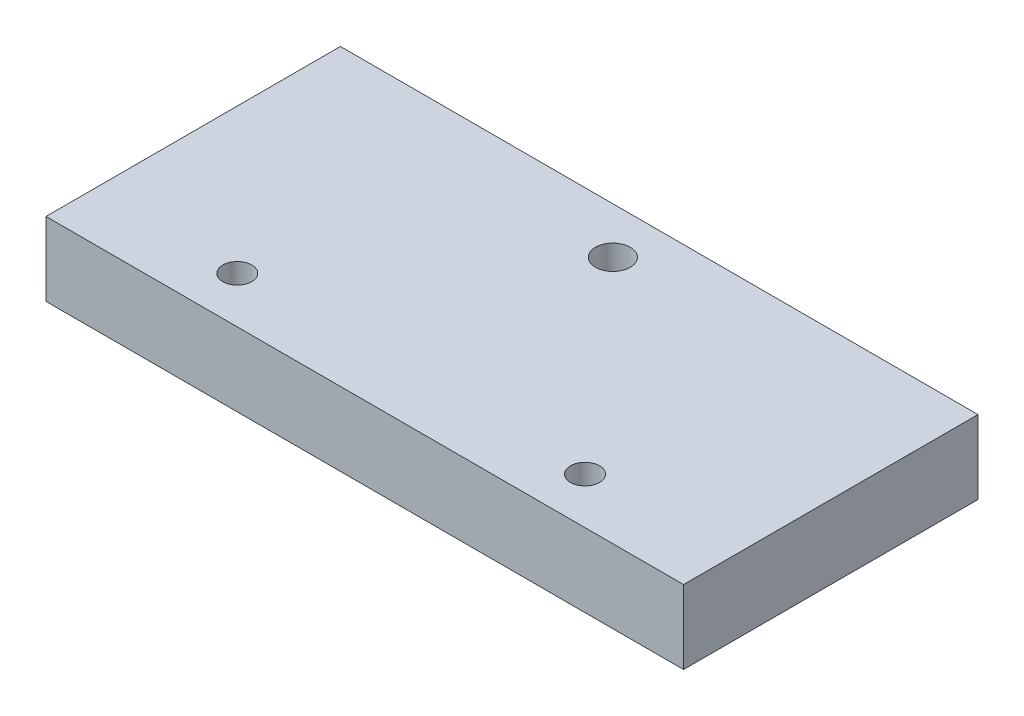
ISO-10303-21;
HEADER;
FILE_DESCRIPTION(('STEP AP214'),'2;1');
FILE_NAME('part.step','',(''),(''),'','','');
FILE_SCHEMA(('AUTOMOTIVE_DESIGN { 1 0 10303 214 1 1 1 1 }'));
ENDSEC;
DATA;
#1=APPLICATION_CONTEXT('core data for automotive mechanical design processes');
#2=APPLICATION_PROTOCOL_DEFINITION('international standard','automotive_design',2000,#1);
#3=PRODUCT_CONTEXT('',#1,'mechanical');
#4=PRODUCT('Part','Part','',(#3));
#5=PRODUCT_RELATED_PRODUCT_CATEGORY('part','',(#4));
#6=PRODUCT_DEFINITION_FORMATION('','',#4);
#7=PRODUCT_DEFINITION_CONTEXT('part definition',#1,'design');
#8=PRODUCT_DEFINITION('design','',#6,#7);
#9=PRODUCT_DEFINITION_SHAPE('','',#8);
#10=(LENGTH_UNIT() NAMED_UNIT(*) SI_UNIT(.MILLI.,.METRE.));
#11=(NAMED_UNIT(*) PLANE_ANGLE_UNIT() SI_UNIT($,.RADIAN.));
#12=(NAMED_UNIT(*) SI_UNIT($,.STERADIAN.) SOLID_ANGLE_UNIT());
#13=UNCERTAINTY_MEASURE_WITH_UNIT(LENGTH_MEASURE(1.E-05),#10,'distance_accuracy_value','');
#14=(GEOMETRIC_REPRESENTATION_CONTEXT(3) GLOBAL_UNCERTAINTY_ASSIGNED_CONTEXT((#13)) GLOBAL_UNIT_ASSIGNED_CONTEXT((#10,
#11,#12)) REPRESENTATION_CONTEXT('',''));
#15=CARTESIAN_POINT('',(0.,0.,0.));
#16=DIRECTION('',(0.,0.,1.));
#17=DIRECTION('',(1.,0.,0.));
#18=AXIS2_PLACEMENT_3D('',#15,#16,#17);
#19=CARTESIAN_POINT('',(-55.,12.7,25.4));
#20=DIRECTION('',(1.,0.,0.));
#21=DIRECTION('',(0.,0.,-1.));
#22=AXIS2_PLACEMENT_3D('',#19,#20,#21);
#23=PLANE('',#22);
#24=DIRECTION('',(0.,0.,1.));
#25=VECTOR('',#24,1.);
#26=CARTESIAN_POINT('',(-55.,0.,25.4));
#27=LINE('',#26,#25);
#28=CARTESIAN_POINT('',(-55.,0.,-25.4));
#29=VERTEX_POINT('',#28);
#30=CARTESIAN_POINT('',(-55.,0.,25.4));
#31=VERTEX_POINT('',#30);
#32=EDGE_CURVE('E96',#29,#31,#27,.T.);
#33=ORIENTED_EDGE('',*,*,#32,.T.);
#34=DIRECTION('',(0.,-1.,0.));
#35=VECTOR('',#34,1.);
#36=CARTESIAN_POINT('',(-55.,12.7,25.4));
#37=LINE('',#36,#35);
#38=CARTESIAN_POINT('',(-55.,12.7,25.4));
#39=VERTEX_POINT('',#38);
#40=EDGE_CURVE('E11',#39,#31,#37,.T.);
#41=ORIENTED_EDGE('',*,*,#40,.F.);
#42=DIRECTION('',(0.,0.,1.));
#43=VECTOR('',#42,1.);
#44=CARTESIAN_POINT('',(-55.,12.7,25.4));
#45=LINE('',#44,#43);
#46=CARTESIAN_POINT('',(-55.,12.7,-25.4));
#47=VERTEX_POINT('',#46);
#48=EDGE_CURVE('E84',#47,#39,#45,.T.);
#49=ORIENTED_EDGE('',*,*,#48,.F.);
#50=DIRECTION('',(0.,-1.,0.));
#51=VECTOR('',#50,1.);
#52=CARTESIAN_POINT('',(-55.,12.7,-25.4));
#53=LINE('',#52,#51);
#54=EDGE_CURVE('E92',#47,#29,#53,.T.);
#55=ORIENTED_EDGE('',*,*,#54,.T.);
#56=EDGE_LOOP('',(#33,#41,#49,#55));
#57=FACE_BOUND('',#56,.T.);
#58=ADVANCED_FACE('F33',(#57),#23,.F.);
#59=CARTESIAN_POINT('',(55.,12.7,25.4));
#60=DIRECTION('',(0.,0.,-1.));
#61=DIRECTION('',(-1.,0.,0.));
#62=AXIS2_PLACEMENT_3D('',#59,#60,#61);
#63=PLANE('',#62);
#64=DIRECTION('',(1.,0.,0.));
#65=VECTOR('',#64,1.);
#66=CARTESIAN_POINT('',(55.,0.,25.4));
#67=LINE('',#66,#65);
#68=CARTESIAN_POINT('',(55.,0.,25.4));
#69=VERTEX_POINT('',#68);
#70=EDGE_CURVE('E88',#31,#69,#67,.T.);
#71=ORIENTED_EDGE('',*,*,#70,.T.);
#72=DIRECTION('',(0.,-1.,0.));
#73=VECTOR('',#72,1.);
#74=CARTESIAN_POINT('',(55.,12.7,25.4));
#75=LINE('',#74,#73);
#76=CARTESIAN_POINT('',(55.,12.7,25.4));
#77=VERTEX_POINT('',#76);
#78=EDGE_CURVE('E41',#77,#69,#75,.T.);
#79=ORIENTED_EDGE('',*,*,#78,.F.);
#80=DIRECTION('',(1.,0.,0.));
#81=VECTOR('',#80,1.);
#82=CARTESIAN_POINT('',(55.,12.7,25.4));
#83=LINE('',#82,#81);
#84=EDGE_CURVE('E79',#39,#77,#83,.T.);
#85=ORIENTED_EDGE('',*,*,#84,.F.);
#86=ORIENTED_EDGE('',*,*,#40,.T.);
#87=EDGE_LOOP('',(#71,#79,#85,#86));
#88=FACE_BOUND('',#87,.T.);
#89=ADVANCED_FACE('F87',(#88),#63,.F.);
#90=CARTESIAN_POINT('',(55.,12.7,25.4));
#91=DIRECTION('',(-1.,0.,0.));
#92=DIRECTION('',(0.,0.,1.));
#93=AXIS2_PLACEMENT_3D('',#90,#91,#92);
#94=PLANE('',#93);
#95=DIRECTION('',(0.,0.,-1.));
#96=VECTOR('',#95,1.);
#97=CARTESIAN_POINT('',(55.,0.,25.4));
#98=LINE('',#97,#96);
#99=CARTESIAN_POINT('',(55.,0.,-25.4));
#100=VERTEX_POINT('',#99);
#101=EDGE_CURVE('E66',#69,#100,#98,.T.);
#102=ORIENTED_EDGE('',*,*,#101,.T.);
#103=DIRECTION('',(0.,-1.,0.));
#104=VECTOR('',#103,1.);
#105=CARTESIAN_POINT('',(55.,12.7,-25.4));
#106=LINE('',#105,#104);
#107=CARTESIAN_POINT('',(55.,12.7,-25.4));
#108=VERTEX_POINT('',#107);
#109=EDGE_CURVE('E89',#108,#100,#106,.T.);
#110=ORIENTED_EDGE('',*,*,#109,.F.);
#111=DIRECTION('',(0.,0.,-1.));
#112=VECTOR('',#111,1.);
#113=CARTESIAN_POINT('',(55.,12.7,25.4));
#114=LINE('',#113,#112);
#115=EDGE_CURVE('E82',#77,#108,#114,.T.);
#116=ORIENTED_EDGE('',*,*,#115,.F.);
#117=ORIENTED_EDGE('',*,*,#78,.T.);
#118=EDGE_LOOP('',(#102,#110,#116,#117));
#119=FACE_BOUND('',#118,.T.);
#120=ADVANCED_FACE('F90',(#119),#94,.F.);
#121=CARTESIAN_POINT('',(55.,12.7,-25.4));
#122=DIRECTION('',(0.,0.,1.));
#123=DIRECTION('',(1.,0.,0.));
#124=AXIS2_PLACEMENT_3D('',#121,#122,#123);
#125=PLANE('',#124);
#126=DIRECTION('',(-1.,0.,0.));
#127=VECTOR('',#126,1.);
#128=CARTESIAN_POINT('',(55.,0.,-25.4));
#129=LINE('',#128,#127);
#130=EDGE_CURVE('E72',#100,#29,#129,.T.);
#131=ORIENTED_EDGE('',*,*,#130,.T.);
#132=ORIENTED_EDGE('',*,*,#54,.F.);
#133=DIRECTION('',(-1.,0.,0.));
#134=VECTOR('',#133,1.);
#135=CARTESIAN_POINT('',(55.,12.7,-25.4));
#136=LINE('',#135,#134);
#137=EDGE_CURVE('E49',#108,#47,#136,.T.);
#138=ORIENTED_EDGE('',*,*,#137,.F.);
#139=ORIENTED_EDGE('',*,*,#109,.T.);
#140=EDGE_LOOP('',(#131,#132,#138,#139));
#141=FACE_BOUND('',#140,.T.);
#142=ADVANCED_FACE('F104',(#141),#125,.F.);
#143=CARTESIAN_POINT('',(0.,12.7,0.));
#144=DIRECTION('',(0.,1.,0.));
#145=DIRECTION('',(0.,0.,1.));
#146=AXIS2_PLACEMENT_3D('',#143,#144,#145);
#147=PLANE('',#146);
#148=CARTESIAN_POINT('',(30.,12.7,17.4));
#149=DIRECTION('',(0.,1.,0.));
#150=DIRECTION('',(0.,0.,1.));
#151=AXIS2_PLACEMENT_3D('',#148,#149,#150);
#152=CIRCLE('',#151,2.5);
#153=CARTESIAN_POINT('',(30.,12.7,19.9));
#154=VERTEX_POINT('',#153);
#155=EDGE_CURVE('E122',#154,#154,#152,.T.);
#156=ORIENTED_EDGE('',*,*,#155,.F.);
#157=EDGE_LOOP('',(#156));
#158=FACE_BOUND('',#157,.T.);
#159=CARTESIAN_POINT('',(0.,12.7,-17.4));
#160=DIRECTION('',(0.,1.,0.));
#161=DIRECTION('',(0.,0.,1.));
#162=AXIS2_PLACEMENT_3D('',#159,#160,#161);
#163=CIRCLE('',#162,3.);
#164=CARTESIAN_POINT('',(0.,12.7,-14.4));
#165=VERTEX_POINT('',#164);
#166=EDGE_CURVE('E116',#165,#165,#163,.T.);
#167=ORIENTED_EDGE('',*,*,#166,.F.);
#168=EDGE_LOOP('',(#167));
#169=FACE_BOUND('',#168,.T.);
#170=CARTESIAN_POINT('',(-30.,12.7,17.4));
#171=DIRECTION('',(0.,1.,0.));
#172=DIRECTION('',(0.,0.,1.));
#173=AXIS2_PLACEMENT_3D('',#170,#171,#172);
#174=CIRCLE('',#173,2.5);
#175=CARTESIAN_POINT('',(-30.,12.7,19.9));
#176=VERTEX_POINT('',#175);
#177=EDGE_CURVE('E110',#176,#176,#174,.T.);
#178=ORIENTED_EDGE('',*,*,#177,.F.);
#179=EDGE_LOOP('',(#178));
#180=FACE_BOUND('',#179,.T.);
#181=ORIENTED_EDGE('',*,*,#48,.T.);
#182=ORIENTED_EDGE('',*,*,#84,.T.);
#183=ORIENTED_EDGE('',*,*,#115,.T.);
#184=ORIENTED_EDGE('',*,*,#137,.T.);
#185=EDGE_LOOP('',(#181,#182,#183,#184));
#186=FACE_BOUND('',#185,.T.);
#187=ADVANCED_FACE('F80',(#158,#169,#180,#186),#147,.T.);
#188=CARTESIAN_POINT('',(0.,0.,0.));
#189=DIRECTION('',(0.,1.,0.));
#190=DIRECTION('',(0.,0.,1.));
#191=AXIS2_PLACEMENT_3D('',#188,#189,#190);
#192=PLANE('',#191);
#193=CARTESIAN_POINT('',(30.,0.,17.4));
#194=DIRECTION('',(0.,1.,0.));
#195=DIRECTION('',(0.,0.,1.));
#196=AXIS2_PLACEMENT_3D('',#193,#194,#195);
#197=CIRCLE('',#196,2.5);
#198=CARTESIAN_POINT('',(30.,0.,19.9));
#199=VERTEX_POINT('',#198);
#200=EDGE_CURVE('E113',#199,#199,#197,.T.);
#201=ORIENTED_EDGE('',*,*,#200,.T.);
#202=EDGE_LOOP('',(#201));
#203=FACE_BOUND('',#202,.T.);
#204=CARTESIAN_POINT('',(0.,0.,-17.4));
#205=DIRECTION('',(0.,1.,0.));
#206=DIRECTION('',(0.,0.,1.));
#207=AXIS2_PLACEMENT_3D('',#204,#205,#206);
#208=CIRCLE('',#207,3.);
#209=CARTESIAN_POINT('',(0.,0.,-14.4));
#210=VERTEX_POINT('',#209);
#211=EDGE_CURVE('E119',#210,#210,#208,.T.);
#212=ORIENTED_EDGE('',*,*,#211,.T.);
#213=EDGE_LOOP('',(#212));
#214=FACE_BOUND('',#213,.T.);
#215=CARTESIAN_POINT('',(-30.,0.,17.4));
#216=DIRECTION('',(0.,1.,0.));
#217=DIRECTION('',(0.,0.,1.));
#218=AXIS2_PLACEMENT_3D('',#215,#216,#217);
#219=CIRCLE('',#218,2.5);
#220=CARTESIAN_POINT('',(-30.,0.,19.9));
#221=VERTEX_POINT('',#220);
#222=EDGE_CURVE('E99',#221,#221,#219,.T.);
#223=ORIENTED_EDGE('',*,*,#222,.T.);
#224=EDGE_LOOP('',(#223));
#225=FACE_BOUND('',#224,.T.);
#226=ORIENTED_EDGE('',*,*,#32,.F.);
#227=ORIENTED_EDGE('',*,*,#130,.F.);
#228=ORIENTED_EDGE('',*,*,#101,.F.);
#229=ORIENTED_EDGE('',*,*,#70,.F.);
#230=EDGE_LOOP('',(#226,#227,#228,#229));
#231=FACE_BOUND('',#230,.T.);
#232=ADVANCED_FACE('F107',(#203,#214,#225,#231),#192,.F.);
#233=CARTESIAN_POINT('',(-30.,0.,17.4));
#234=DIRECTION('',(0.,1.,0.));
#235=DIRECTION('',(0.,0.,1.));
#236=AXIS2_PLACEMENT_3D('',#233,#234,#235);
#237=CYLINDRICAL_SURFACE('',#236,2.5);
#238=ORIENTED_EDGE('',*,*,#222,.F.);
#239=EDGE_LOOP('',(#238));
#240=FACE_BOUND('',#239,.T.);
#241=ORIENTED_EDGE('',*,*,#177,.T.);
#242=EDGE_LOOP('',(#241));
#243=FACE_BOUND('',#242,.T.);
#244=ADVANCED_FACE('F144',(#240,#243),#237,.F.);
#245=CARTESIAN_POINT('',(0.,0.,-17.4));
#246=DIRECTION('',(0.,1.,0.));
#247=DIRECTION('',(0.,0.,1.));
#248=AXIS2_PLACEMENT_3D('',#245,#246,#247);
#249=CYLINDRICAL_SURFACE('',#248,3.);
#250=ORIENTED_EDGE('',*,*,#211,.F.);
#251=EDGE_LOOP('',(#250));
#252=FACE_BOUND('',#251,.T.);
#253=ORIENTED_EDGE('',*,*,#166,.T.);
#254=EDGE_LOOP('',(#253));
#255=FACE_BOUND('',#254,.T.);
#256=ADVANCED_FACE('F133',(#252,#255),#249,.F.);
#257=CARTESIAN_POINT('',(30.,0.,17.4));
#258=DIRECTION('',(0.,1.,0.));
#259=DIRECTION('',(0.,0.,1.));
#260=AXIS2_PLACEMENT_3D('',#257,#258,#259);
#261=CYLINDRICAL_SURFACE('',#260,2.5);
#262=ORIENTED_EDGE('',*,*,#200,.F.);
#263=EDGE_LOOP('',(#262));
#264=FACE_BOUND('',#263,.T.);
#265=ORIENTED_EDGE('',*,*,#155,.T.);
#266=EDGE_LOOP('',(#265));
#267=FACE_BOUND('',#266,.T.);
#268=ADVANCED_FACE('F130',(#264,#267),#261,.F.);
#269=CLOSED_SHELL('',(#58,#89,#120,#142,#187,#232,#244,#256,#268));
#270=MANIFOLD_SOLID_BREP('B2',#269);
#271=ADVANCED_BREP_SHAPE_REPRESENTATION('',(#18,#270),#14);
#272=SHAPE_DEFINITION_REPRESENTATION(#9,#271);
ENDSEC;
END-ISO-10303-21;
